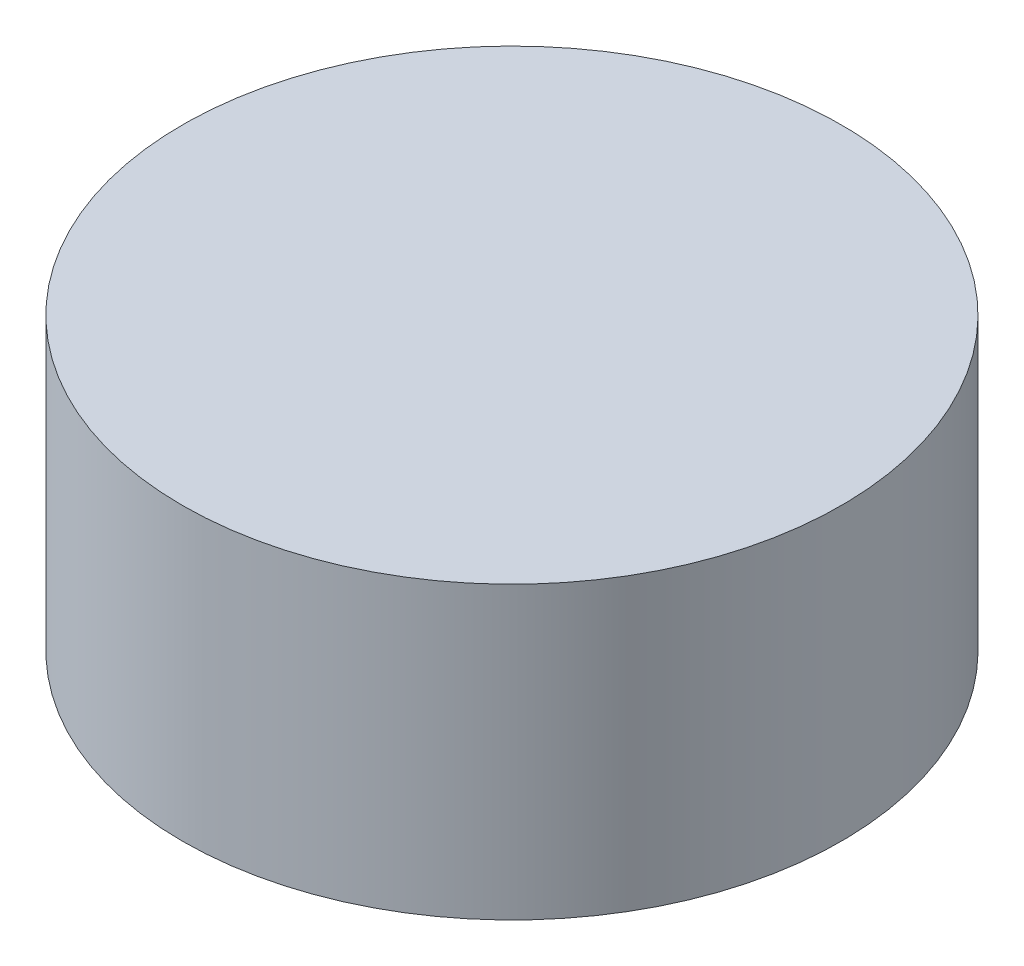
ISO-10303-21;
HEADER;
FILE_DESCRIPTION(('STEP AP214'),'2;1');
FILE_NAME('part.step','',(''),(''),'','','');
FILE_SCHEMA(('AUTOMOTIVE_DESIGN { 1 0 10303 214 1 1 1 1 }'));
ENDSEC;
DATA;
#1=APPLICATION_CONTEXT('core data for automotive mechanical design processes');
#2=APPLICATION_PROTOCOL_DEFINITION('international standard','automotive_design',2000,#1);
#3=PRODUCT_CONTEXT('',#1,'mechanical');
#4=PRODUCT('Part','Part','',(#3));
#5=PRODUCT_RELATED_PRODUCT_CATEGORY('part','',(#4));
#6=PRODUCT_DEFINITION_FORMATION('','',#4);
#7=PRODUCT_DEFINITION_CONTEXT('part definition',#1,'design');
#8=PRODUCT_DEFINITION('design','',#6,#7);
#9=PRODUCT_DEFINITION_SHAPE('','',#8);
#10=(LENGTH_UNIT() NAMED_UNIT(*) SI_UNIT(.MILLI.,.METRE.));
#11=(NAMED_UNIT(*) PLANE_ANGLE_UNIT() SI_UNIT($,.RADIAN.));
#12=(NAMED_UNIT(*) SI_UNIT($,.STERADIAN.) SOLID_ANGLE_UNIT());
#13=UNCERTAINTY_MEASURE_WITH_UNIT(LENGTH_MEASURE(1.E-05),#10,'distance_accuracy_value','');
#14=(GEOMETRIC_REPRESENTATION_CONTEXT(3) GLOBAL_UNCERTAINTY_ASSIGNED_CONTEXT((#13)) GLOBAL_UNIT_ASSIGNED_CONTEXT((#10,
#11,#12)) REPRESENTATION_CONTEXT('',''));
#15=CARTESIAN_POINT('',(0.,0.,0.));
#16=DIRECTION('',(0.,0.,1.));
#17=DIRECTION('',(1.,0.,0.));
#18=AXIS2_PLACEMENT_3D('',#15,#16,#17);
#19=CARTESIAN_POINT('',(0.,15.,0.));
#20=DIRECTION('',(0.,-1.,0.));
#21=DIRECTION('',(0.,0.,-1.));
#22=AXIS2_PLACEMENT_3D('',#19,#20,#21);
#23=CYLINDRICAL_SURFACE('',#22,17.);
#24=CARTESIAN_POINT('',(0.,15.,0.));
#25=DIRECTION('',(0.,1.,0.));
#26=DIRECTION('',(0.,0.,1.));
#27=AXIS2_PLACEMENT_3D('',#24,#25,#26);
#28=CIRCLE('',#27,17.);
#29=CARTESIAN_POINT('',(0.,15.,17.));
#30=VERTEX_POINT('',#29);
#31=EDGE_CURVE('E49',#30,#30,#28,.T.);
#32=ORIENTED_EDGE('',*,*,#31,.F.);
#33=EDGE_LOOP('',(#32));
#34=FACE_BOUND('',#33,.T.);
#35=CARTESIAN_POINT('',(0.,0.,0.));
#36=DIRECTION('',(0.,1.,0.));
#37=DIRECTION('',(0.,0.,1.));
#38=AXIS2_PLACEMENT_3D('',#35,#36,#37);
#39=CIRCLE('',#38,17.);
#40=CARTESIAN_POINT('',(0.,0.,17.));
#41=VERTEX_POINT('',#40);
#42=EDGE_CURVE('E52',#41,#41,#39,.T.);
#43=ORIENTED_EDGE('',*,*,#42,.T.);
#44=EDGE_LOOP('',(#43));
#45=FACE_BOUND('',#44,.T.);
#46=ADVANCED_FACE('F35',(#34,#45),#23,.T.);
#47=CARTESIAN_POINT('',(0.,15.,0.));
#48=DIRECTION('',(0.,1.,0.));
#49=DIRECTION('',(0.,0.,1.));
#50=AXIS2_PLACEMENT_3D('',#47,#48,#49);
#51=PLANE('',#50);
#52=ORIENTED_EDGE('',*,*,#31,.T.);
#53=EDGE_LOOP('',(#52));
#54=FACE_BOUND('',#53,.T.);
#55=ADVANCED_FACE('F118',(#54),#51,.T.);
#56=CARTESIAN_POINT('',(0.,0.,0.));
#57=DIRECTION('',(0.,1.,0.));
#58=DIRECTION('',(0.,0.,1.));
#59=AXIS2_PLACEMENT_3D('',#56,#57,#58);
#60=PLANE('',#59);
#61=CARTESIAN_POINT('',(-8.66025403784442,0.,4.99999999999923));
#62=DIRECTION('',(0.,1.,0.));
#63=DIRECTION('',(0.,0.,1.));
#64=AXIS2_PLACEMENT_3D('',#61,#62,#63);
#65=CIRCLE('',#64,2.00000000000051);
#66=CARTESIAN_POINT('',(-8.66025403784442,0.,6.99999999999974));
#67=VERTEX_POINT('',#66);
#68=EDGE_CURVE('E10',#67,#67,#65,.F.);
#69=ORIENTED_EDGE('',*,*,#68,.F.);
#70=EDGE_LOOP('',(#69));
#71=FACE_BOUND('',#70,.T.);
#72=CARTESIAN_POINT('',(6.78395757577542E-13,0.,-10.0000000000004));
#73=DIRECTION('',(0.,1.,0.));
#74=DIRECTION('',(0.,0.,1.));
#75=AXIS2_PLACEMENT_3D('',#72,#73,#74);
#76=CIRCLE('',#75,1.9999999999998);
#77=CARTESIAN_POINT('',(6.78395757577542E-13,0.,-8.00000000000057));
#78=VERTEX_POINT('',#77);
#79=EDGE_CURVE('E41',#78,#78,#76,.F.);
#80=ORIENTED_EDGE('',*,*,#79,.F.);
#81=EDGE_LOOP('',(#80));
#82=FACE_BOUND('',#81,.T.);
#83=CARTESIAN_POINT('',(8.66025403784436,0.,5.00000000000004));
#84=DIRECTION('',(0.,-1.,0.));
#85=DIRECTION('',(0.,0.,-1.));
#86=AXIS2_PLACEMENT_3D('',#83,#84,#85);
#87=CIRCLE('',#86,2.);
#88=CARTESIAN_POINT('',(8.66025403784436,0.,3.00000000000004));
#89=VERTEX_POINT('',#88);
#90=EDGE_CURVE('E45',#89,#89,#87,.T.);
#91=ORIENTED_EDGE('',*,*,#90,.F.);
#92=EDGE_LOOP('',(#91));
#93=FACE_BOUND('',#92,.T.);
#94=CARTESIAN_POINT('',(10.2000000000004,0.,2.04907423764532E-13));
#95=DIRECTION('',(0.,-1.,0.));
#96=DIRECTION('',(0.,0.,-1.));
#97=AXIS2_PLACEMENT_3D('',#94,#95,#96);
#98=CIRCLE('',#97,1.49999999999989);
#99=CARTESIAN_POINT('',(10.2000000000004,0.,-1.49999999999968));
#100=VERTEX_POINT('',#99);
#101=EDGE_CURVE('E79',#100,#100,#98,.T.);
#102=ORIENTED_EDGE('',*,*,#101,.F.);
#103=EDGE_LOOP('',(#102));
#104=FACE_BOUND('',#103,.T.);
#105=CARTESIAN_POINT('',(-5.09999999999926,0.,-8.8334591186017));
#106=DIRECTION('',(0.,-1.,0.));
#107=DIRECTION('',(0.,0.,-1.));
#108=AXIS2_PLACEMENT_3D('',#105,#106,#107);
#109=CIRCLE('',#108,1.50000000000063);
#110=CARTESIAN_POINT('',(-5.09999999999926,0.,-10.3334591186023));
#111=VERTEX_POINT('',#110);
#112=EDGE_CURVE('E68',#111,#111,#109,.T.);
#113=ORIENTED_EDGE('',*,*,#112,.F.);
#114=EDGE_LOOP('',(#113));
#115=FACE_BOUND('',#114,.T.);
#116=CARTESIAN_POINT('',(-10.1999999999996,0.,-6.41551805447473E-13));
#117=DIRECTION('',(0.,-1.,0.));
#118=DIRECTION('',(0.,0.,-1.));
#119=AXIS2_PLACEMENT_3D('',#116,#117,#118);
#120=CIRCLE('',#119,1.50000000000078);
#121=CARTESIAN_POINT('',(-10.1999999999996,0.,-1.50000000000142));
#122=VERTEX_POINT('',#121);
#123=EDGE_CURVE('E67',#122,#122,#120,.T.);
#124=ORIENTED_EDGE('',*,*,#123,.F.);
#125=EDGE_LOOP('',(#124));
#126=FACE_BOUND('',#125,.T.);
#127=CARTESIAN_POINT('',(5.10000000000001,0.,8.83345911860127));
#128=DIRECTION('',(0.,-1.,0.));
#129=DIRECTION('',(0.,0.,-1.));
#130=AXIS2_PLACEMENT_3D('',#127,#128,#129);
#131=CIRCLE('',#130,1.5);
#132=CARTESIAN_POINT('',(5.10000000000001,0.,7.33345911860127));
#133=VERTEX_POINT('',#132);
#134=EDGE_CURVE('E61',#133,#133,#131,.T.);
#135=ORIENTED_EDGE('',*,*,#134,.F.);
#136=EDGE_LOOP('',(#135));
#137=FACE_BOUND('',#136,.T.);
#138=CARTESIAN_POINT('',(5.10000000000074,0.,-8.83345911860128));
#139=DIRECTION('',(0.,-1.,0.));
#140=DIRECTION('',(0.,0.,-1.));
#141=AXIS2_PLACEMENT_3D('',#138,#139,#140);
#142=CIRCLE('',#141,1.5000000000002);
#143=CARTESIAN_POINT('',(5.10000000000074,0.,-10.3334591186015));
#144=VERTEX_POINT('',#143);
#145=EDGE_CURVE('E80',#144,#144,#142,.T.);
#146=ORIENTED_EDGE('',*,*,#145,.F.);
#147=EDGE_LOOP('',(#146));
#148=FACE_BOUND('',#147,.T.);
#149=CARTESIAN_POINT('',(-5.1,0.,8.83345911860084));
#150=DIRECTION('',(0.,-1.,0.));
#151=DIRECTION('',(0.,0.,-1.));
#152=AXIS2_PLACEMENT_3D('',#149,#150,#151);
#153=CIRCLE('',#152,1.50000000000051);
#154=CARTESIAN_POINT('',(-5.1,0.,7.33345911860034));
#155=VERTEX_POINT('',#154);
#156=EDGE_CURVE('E58',#155,#155,#153,.T.);
#157=ORIENTED_EDGE('',*,*,#156,.F.);
#158=EDGE_LOOP('',(#157));
#159=FACE_BOUND('',#158,.T.);
#160=ORIENTED_EDGE('',*,*,#42,.F.);
#161=EDGE_LOOP('',(#160));
#162=FACE_BOUND('',#161,.T.);
#163=ADVANCED_FACE('F123',(#71,#82,#93,#104,#115,#126,#137,#148,#159,#162),#60,.F.);
#164=CARTESIAN_POINT('',(-5.1,5.,8.83345911860084));
#165=DIRECTION('',(0.,-1.,0.));
#166=DIRECTION('',(0.,0.,-1.));
#167=AXIS2_PLACEMENT_3D('',#164,#165,#166);
#168=CYLINDRICAL_SURFACE('',#167,1.50000000000051);
#169=CARTESIAN_POINT('',(-5.1,5.,8.83345911860084));
#170=DIRECTION('',(0.,-1.,0.));
#171=DIRECTION('',(0.,0.,-1.));
#172=AXIS2_PLACEMENT_3D('',#169,#170,#171);
#173=CIRCLE('',#172,1.50000000000051);
#174=CARTESIAN_POINT('',(-5.1,5.,7.33345911860034));
#175=VERTEX_POINT('',#174);
#176=EDGE_CURVE('E55',#175,#175,#173,.T.);
#177=ORIENTED_EDGE('',*,*,#176,.F.);
#178=EDGE_LOOP('',(#177));
#179=FACE_BOUND('',#178,.T.);
#180=ORIENTED_EDGE('',*,*,#156,.T.);
#181=EDGE_LOOP('',(#180));
#182=FACE_BOUND('',#181,.T.);
#183=ADVANCED_FACE('F131',(#179,#182),#168,.F.);
#184=CARTESIAN_POINT('',(-5.1,5.,8.83345911860084));
#185=DIRECTION('',(0.,-1.,0.));
#186=DIRECTION('',(0.,0.,-1.));
#187=AXIS2_PLACEMENT_3D('',#184,#185,#186);
#188=PLANE('',#187);
#189=ORIENTED_EDGE('',*,*,#176,.T.);
#190=EDGE_LOOP('',(#189));
#191=FACE_BOUND('',#190,.T.);
#192=ADVANCED_FACE('F136',(#191),#188,.T.);
#193=CARTESIAN_POINT('',(5.10000000000074,5.,-8.83345911860128));
#194=DIRECTION('',(0.,-1.,0.));
#195=DIRECTION('',(0.,0.,-1.));
#196=AXIS2_PLACEMENT_3D('',#193,#194,#195);
#197=CYLINDRICAL_SURFACE('',#196,1.5000000000002);
#198=CARTESIAN_POINT('',(5.10000000000074,5.,-8.83345911860128));
#199=DIRECTION('',(0.,-1.,0.));
#200=DIRECTION('',(0.,0.,-1.));
#201=AXIS2_PLACEMENT_3D('',#198,#199,#200);
#202=CIRCLE('',#201,1.5000000000002);
#203=CARTESIAN_POINT('',(5.10000000000074,5.,-10.3334591186015));
#204=VERTEX_POINT('',#203);
#205=EDGE_CURVE('E88',#204,#204,#202,.T.);
#206=ORIENTED_EDGE('',*,*,#205,.F.);
#207=EDGE_LOOP('',(#206));
#208=FACE_BOUND('',#207,.T.);
#209=ORIENTED_EDGE('',*,*,#145,.T.);
#210=EDGE_LOOP('',(#209));
#211=FACE_BOUND('',#210,.T.);
#212=ADVANCED_FACE('F143',(#208,#211),#197,.F.);
#213=CARTESIAN_POINT('',(5.10000000000074,5.,-8.83345911860128));
#214=DIRECTION('',(0.,-1.,0.));
#215=DIRECTION('',(0.,0.,-1.));
#216=AXIS2_PLACEMENT_3D('',#213,#214,#215);
#217=PLANE('',#216);
#218=ORIENTED_EDGE('',*,*,#205,.T.);
#219=EDGE_LOOP('',(#218));
#220=FACE_BOUND('',#219,.T.);
#221=ADVANCED_FACE('F161',(#220),#217,.T.);
#222=CARTESIAN_POINT('',(5.10000000000001,5.,8.83345911860127));
#223=DIRECTION('',(0.,-1.,0.));
#224=DIRECTION('',(0.,0.,-1.));
#225=AXIS2_PLACEMENT_3D('',#222,#223,#224);
#226=CYLINDRICAL_SURFACE('',#225,1.5);
#227=CARTESIAN_POINT('',(5.10000000000001,5.,8.83345911860127));
#228=DIRECTION('',(0.,-1.,0.));
#229=DIRECTION('',(0.,0.,-1.));
#230=AXIS2_PLACEMENT_3D('',#227,#228,#229);
#231=CIRCLE('',#230,1.5);
#232=CARTESIAN_POINT('',(5.10000000000001,5.,7.33345911860127));
#233=VERTEX_POINT('',#232);
#234=EDGE_CURVE('E71',#233,#233,#231,.T.);
#235=ORIENTED_EDGE('',*,*,#234,.F.);
#236=EDGE_LOOP('',(#235));
#237=FACE_BOUND('',#236,.T.);
#238=ORIENTED_EDGE('',*,*,#134,.T.);
#239=EDGE_LOOP('',(#238));
#240=FACE_BOUND('',#239,.T.);
#241=ADVANCED_FACE('F157',(#237,#240),#226,.F.);
#242=CARTESIAN_POINT('',(5.10000000000001,5.,8.83345911860127));
#243=DIRECTION('',(0.,-1.,0.));
#244=DIRECTION('',(0.,0.,-1.));
#245=AXIS2_PLACEMENT_3D('',#242,#243,#244);
#246=PLANE('',#245);
#247=ORIENTED_EDGE('',*,*,#234,.T.);
#248=EDGE_LOOP('',(#247));
#249=FACE_BOUND('',#248,.T.);
#250=ADVANCED_FACE('F153',(#249),#246,.T.);
#251=CARTESIAN_POINT('',(-10.1999999999996,5.,-6.41551805447473E-13));
#252=DIRECTION('',(0.,-1.,0.));
#253=DIRECTION('',(0.,0.,-1.));
#254=AXIS2_PLACEMENT_3D('',#251,#252,#253);
#255=CYLINDRICAL_SURFACE('',#254,1.50000000000078);
#256=CARTESIAN_POINT('',(-10.1999999999996,5.,-6.41551805447473E-13));
#257=DIRECTION('',(0.,-1.,0.));
#258=DIRECTION('',(0.,0.,-1.));
#259=AXIS2_PLACEMENT_3D('',#256,#257,#258);
#260=CIRCLE('',#259,1.50000000000078);
#261=CARTESIAN_POINT('',(-10.1999999999996,5.,-1.50000000000142));
#262=VERTEX_POINT('',#261);
#263=EDGE_CURVE('E64',#262,#262,#260,.T.);
#264=ORIENTED_EDGE('',*,*,#263,.F.);
#265=EDGE_LOOP('',(#264));
#266=FACE_BOUND('',#265,.T.);
#267=ORIENTED_EDGE('',*,*,#123,.T.);
#268=EDGE_LOOP('',(#267));
#269=FACE_BOUND('',#268,.T.);
#270=ADVANCED_FACE('F149',(#266,#269),#255,.F.);
#271=CARTESIAN_POINT('',(-10.1999999999996,5.,-6.41551805447473E-13));
#272=DIRECTION('',(0.,-1.,0.));
#273=DIRECTION('',(0.,0.,-1.));
#274=AXIS2_PLACEMENT_3D('',#271,#272,#273);
#275=PLANE('',#274);
#276=ORIENTED_EDGE('',*,*,#263,.T.);
#277=EDGE_LOOP('',(#276));
#278=FACE_BOUND('',#277,.T.);
#279=ADVANCED_FACE('F145',(#278),#275,.T.);
#280=CARTESIAN_POINT('',(-5.09999999999926,5.,-8.8334591186017));
#281=DIRECTION('',(0.,-1.,0.));
#282=DIRECTION('',(0.,0.,-1.));
#283=AXIS2_PLACEMENT_3D('',#280,#281,#282);
#284=CYLINDRICAL_SURFACE('',#283,1.50000000000063);
#285=CARTESIAN_POINT('',(-5.09999999999926,5.,-8.8334591186017));
#286=DIRECTION('',(0.,-1.,0.));
#287=DIRECTION('',(0.,0.,-1.));
#288=AXIS2_PLACEMENT_3D('',#285,#286,#287);
#289=CIRCLE('',#288,1.50000000000063);
#290=CARTESIAN_POINT('',(-5.09999999999926,5.,-10.3334591186023));
#291=VERTEX_POINT('',#290);
#292=EDGE_CURVE('E83',#291,#291,#289,.T.);
#293=ORIENTED_EDGE('',*,*,#292,.F.);
#294=EDGE_LOOP('',(#293));
#295=FACE_BOUND('',#294,.T.);
#296=ORIENTED_EDGE('',*,*,#112,.T.);
#297=EDGE_LOOP('',(#296));
#298=FACE_BOUND('',#297,.T.);
#299=ADVANCED_FACE('F148',(#295,#298),#284,.F.);
#300=CARTESIAN_POINT('',(-5.09999999999926,5.,-8.8334591186017));
#301=DIRECTION('',(0.,-1.,0.));
#302=DIRECTION('',(0.,0.,-1.));
#303=AXIS2_PLACEMENT_3D('',#300,#301,#302);
#304=PLANE('',#303);
#305=ORIENTED_EDGE('',*,*,#292,.T.);
#306=EDGE_LOOP('',(#305));
#307=FACE_BOUND('',#306,.T.);
#308=ADVANCED_FACE('F171',(#307),#304,.T.);
#309=CARTESIAN_POINT('',(10.2000000000004,5.,2.04907423764532E-13));
#310=DIRECTION('',(0.,-1.,0.));
#311=DIRECTION('',(0.,0.,-1.));
#312=AXIS2_PLACEMENT_3D('',#309,#310,#311);
#313=CYLINDRICAL_SURFACE('',#312,1.49999999999989);
#314=CARTESIAN_POINT('',(10.2000000000004,5.,2.04907423764532E-13));
#315=DIRECTION('',(0.,-1.,0.));
#316=DIRECTION('',(0.,0.,-1.));
#317=AXIS2_PLACEMENT_3D('',#314,#315,#316);
#318=CIRCLE('',#317,1.49999999999989);
#319=CARTESIAN_POINT('',(10.2000000000004,5.,-1.49999999999968));
#320=VERTEX_POINT('',#319);
#321=EDGE_CURVE('E76',#320,#320,#318,.T.);
#322=ORIENTED_EDGE('',*,*,#321,.F.);
#323=EDGE_LOOP('',(#322));
#324=FACE_BOUND('',#323,.T.);
#325=ORIENTED_EDGE('',*,*,#101,.T.);
#326=EDGE_LOOP('',(#325));
#327=FACE_BOUND('',#326,.T.);
#328=ADVANCED_FACE('F167',(#324,#327),#313,.F.);
#329=CARTESIAN_POINT('',(10.2000000000004,5.,2.04907423764532E-13));
#330=DIRECTION('',(0.,-1.,0.));
#331=DIRECTION('',(0.,0.,-1.));
#332=AXIS2_PLACEMENT_3D('',#329,#330,#331);
#333=PLANE('',#332);
#334=ORIENTED_EDGE('',*,*,#321,.T.);
#335=EDGE_LOOP('',(#334));
#336=FACE_BOUND('',#335,.T.);
#337=ADVANCED_FACE('F163',(#336),#333,.T.);
#338=CARTESIAN_POINT('',(8.66025403784436,-3.5,5.00000000000004));
#339=DIRECTION('',(0.,1.,0.));
#340=DIRECTION('',(0.,0.,1.));
#341=AXIS2_PLACEMENT_3D('',#338,#339,#340);
#342=CYLINDRICAL_SURFACE('',#341,2.);
#343=CARTESIAN_POINT('',(8.66025403784436,-3.5,5.00000000000004));
#344=DIRECTION('',(0.,-1.,0.));
#345=DIRECTION('',(0.,0.,-1.));
#346=AXIS2_PLACEMENT_3D('',#343,#344,#345);
#347=CIRCLE('',#346,2.);
#348=CARTESIAN_POINT('',(8.66025403784436,-3.5,3.00000000000004));
#349=VERTEX_POINT('',#348);
#350=EDGE_CURVE('E91',#349,#349,#347,.T.);
#351=ORIENTED_EDGE('',*,*,#350,.F.);
#352=EDGE_LOOP('',(#351));
#353=FACE_BOUND('',#352,.T.);
#354=ORIENTED_EDGE('',*,*,#90,.T.);
#355=EDGE_LOOP('',(#354));
#356=FACE_BOUND('',#355,.T.);
#357=ADVANCED_FACE('F166',(#353,#356),#342,.T.);
#358=CARTESIAN_POINT('',(8.66025403784436,-3.5,5.00000000000004));
#359=DIRECTION('',(0.,-1.,0.));
#360=DIRECTION('',(0.,0.,-1.));
#361=AXIS2_PLACEMENT_3D('',#358,#359,#360);
#362=PLANE('',#361);
#363=ORIENTED_EDGE('',*,*,#350,.T.);
#364=EDGE_LOOP('',(#363));
#365=FACE_BOUND('',#364,.T.);
#366=ADVANCED_FACE('F187',(#365),#362,.T.);
#367=CARTESIAN_POINT('',(6.78395757577542E-13,-3.5,-10.0000000000004));
#368=DIRECTION('',(0.,1.,0.));
#369=DIRECTION('',(0.,0.,1.));
#370=AXIS2_PLACEMENT_3D('',#367,#368,#369);
#371=CYLINDRICAL_SURFACE('',#370,1.9999999999998);
#372=CARTESIAN_POINT('',(6.78395757577542E-13,-3.5,-10.0000000000004));
#373=DIRECTION('',(0.,-1.,0.));
#374=DIRECTION('',(0.,0.,-1.));
#375=AXIS2_PLACEMENT_3D('',#372,#373,#374);
#376=CIRCLE('',#375,1.9999999999998);
#377=CARTESIAN_POINT('',(6.78395757577542E-13,-3.5,-12.0000000000002));
#378=VERTEX_POINT('',#377);
#379=EDGE_CURVE('E96',#378,#378,#376,.T.);
#380=ORIENTED_EDGE('',*,*,#379,.F.);
#381=EDGE_LOOP('',(#380));
#382=FACE_BOUND('',#381,.T.);
#383=ORIENTED_EDGE('',*,*,#79,.T.);
#384=EDGE_LOOP('',(#383));
#385=FACE_BOUND('',#384,.T.);
#386=ADVANCED_FACE('F114',(#382,#385),#371,.T.);
#387=CARTESIAN_POINT('',(6.78395757577542E-13,-3.5,-10.0000000000004));
#388=DIRECTION('',(0.,-1.,0.));
#389=DIRECTION('',(0.,0.,-1.));
#390=AXIS2_PLACEMENT_3D('',#387,#388,#389);
#391=PLANE('',#390);
#392=ORIENTED_EDGE('',*,*,#379,.T.);
#393=EDGE_LOOP('',(#392));
#394=FACE_BOUND('',#393,.T.);
#395=ADVANCED_FACE('F107',(#394),#391,.T.);
#396=CARTESIAN_POINT('',(-8.66025403784442,-3.5,4.99999999999923));
#397=DIRECTION('',(0.,1.,0.));
#398=DIRECTION('',(0.,0.,1.));
#399=AXIS2_PLACEMENT_3D('',#396,#397,#398);
#400=CYLINDRICAL_SURFACE('',#399,2.00000000000051);
#401=CARTESIAN_POINT('',(-8.66025403784442,-3.5,4.99999999999923));
#402=DIRECTION('',(0.,-1.,0.));
#403=DIRECTION('',(0.,0.,-1.));
#404=AXIS2_PLACEMENT_3D('',#401,#402,#403);
#405=CIRCLE('',#404,2.00000000000051);
#406=CARTESIAN_POINT('',(-8.66025403784442,-3.5,2.99999999999872));
#407=VERTEX_POINT('',#406);
#408=EDGE_CURVE('E99',#407,#407,#405,.T.);
#409=ORIENTED_EDGE('',*,*,#408,.F.);
#410=EDGE_LOOP('',(#409));
#411=FACE_BOUND('',#410,.T.);
#412=ORIENTED_EDGE('',*,*,#68,.T.);
#413=EDGE_LOOP('',(#412));
#414=FACE_BOUND('',#413,.T.);
#415=ADVANCED_FACE('F105',(#411,#414),#400,.T.);
#416=CARTESIAN_POINT('',(-8.66025403784442,-3.5,4.99999999999923));
#417=DIRECTION('',(0.,-1.,0.));
#418=DIRECTION('',(0.,0.,-1.));
#419=AXIS2_PLACEMENT_3D('',#416,#417,#418);
#420=PLANE('',#419);
#421=ORIENTED_EDGE('',*,*,#408,.T.);
#422=EDGE_LOOP('',(#421));
#423=FACE_BOUND('',#422,.T.);
#424=ADVANCED_FACE('F103',(#423),#420,.T.);
#425=CLOSED_SHELL('',(#46,#55,#163,#183,#192,#212,#221,#241,#250,#270,#279,#299,#308,#328,#337,
#357,#366,#386,#395,#415,#424));
#426=MANIFOLD_SOLID_BREP('B2',#425);
#427=ADVANCED_BREP_SHAPE_REPRESENTATION('',(#18,#426),#14);
#428=SHAPE_DEFINITION_REPRESENTATION(#9,#427);
ENDSEC;
END-ISO-10303-21;
